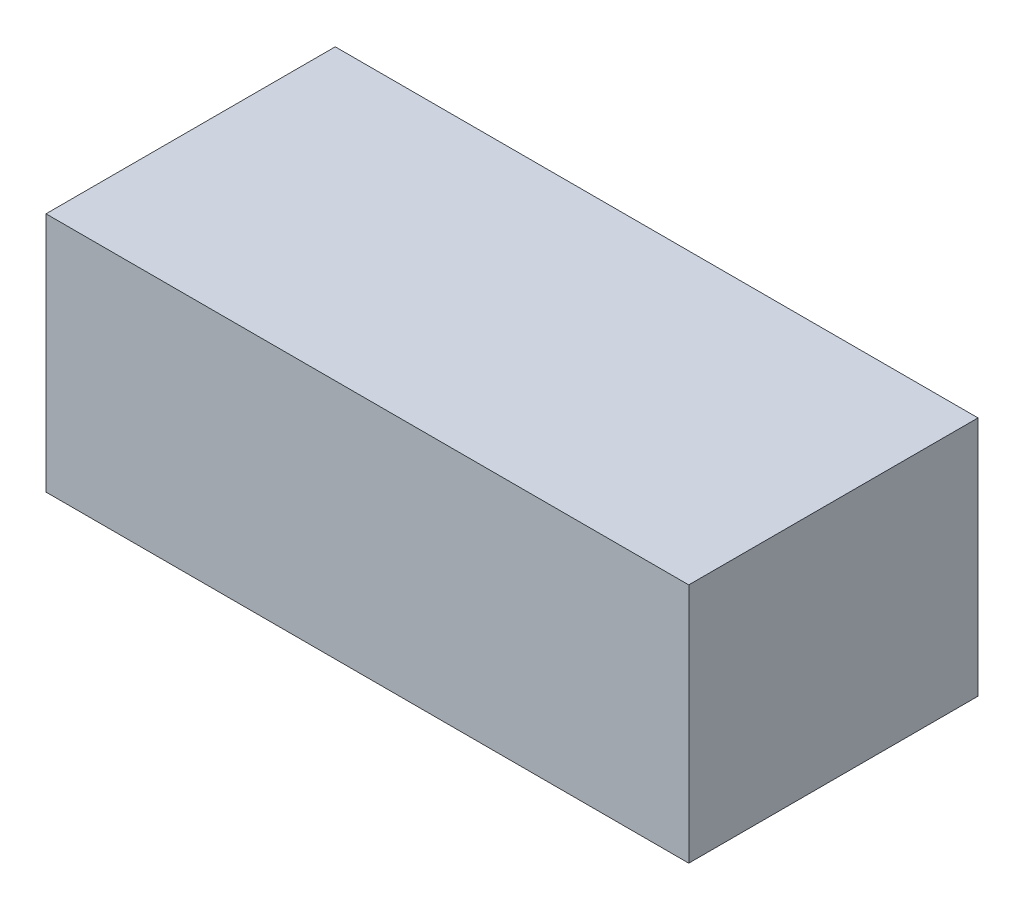
ISO-10303-21;
HEADER;
FILE_DESCRIPTION(('STEP AP214'),'2;1');
FILE_NAME('part.step','',(''),(''),'','','');
FILE_SCHEMA(('AUTOMOTIVE_DESIGN { 1 0 10303 214 1 1 1 1 }'));
ENDSEC;
DATA;
#1=APPLICATION_CONTEXT('core data for automotive mechanical design processes');
#2=APPLICATION_PROTOCOL_DEFINITION('international standard','automotive_design',2000,#1);
#3=PRODUCT_CONTEXT('',#1,'mechanical');
#4=PRODUCT('Part','Part','',(#3));
#5=PRODUCT_RELATED_PRODUCT_CATEGORY('part','',(#4));
#6=PRODUCT_DEFINITION_FORMATION('','',#4);
#7=PRODUCT_DEFINITION_CONTEXT('part definition',#1,'design');
#8=PRODUCT_DEFINITION('design','',#6,#7);
#9=PRODUCT_DEFINITION_SHAPE('','',#8);
#10=(LENGTH_UNIT() NAMED_UNIT(*) SI_UNIT(.MILLI.,.METRE.));
#11=(NAMED_UNIT(*) PLANE_ANGLE_UNIT() SI_UNIT($,.RADIAN.));
#12=(NAMED_UNIT(*) SI_UNIT($,.STERADIAN.) SOLID_ANGLE_UNIT());
#13=UNCERTAINTY_MEASURE_WITH_UNIT(LENGTH_MEASURE(1.E-05),#10,'distance_accuracy_value','');
#14=(GEOMETRIC_REPRESENTATION_CONTEXT(3) GLOBAL_UNCERTAINTY_ASSIGNED_CONTEXT((#13)) GLOBAL_UNIT_ASSIGNED_CONTEXT((#10,
#11,#12)) REPRESENTATION_CONTEXT('',''));
#15=CARTESIAN_POINT('',(0.,0.,0.));
#16=DIRECTION('',(0.,0.,1.));
#17=DIRECTION('',(1.,0.,0.));
#18=AXIS2_PLACEMENT_3D('',#15,#16,#17);
#19=CARTESIAN_POINT('',(0.,75.,0.));
#20=DIRECTION('',(1.,0.,0.));
#21=DIRECTION('',(0.,0.,-1.));
#22=AXIS2_PLACEMENT_3D('',#19,#20,#21);
#23=PLANE('',#22);
#24=DIRECTION('',(0.,0.,1.));
#25=VECTOR('',#24,1.);
#26=CARTESIAN_POINT('',(0.,0.,0.));
#27=LINE('',#26,#25);
#28=CARTESIAN_POINT('',(0.,0.,-90.));
#29=VERTEX_POINT('',#28);
#30=CARTESIAN_POINT('',(0.,0.,0.));
#31=VERTEX_POINT('',#30);
#32=EDGE_CURVE('E119',#29,#31,#27,.T.);
#33=ORIENTED_EDGE('',*,*,#32,.T.);
#34=DIRECTION('',(0.,-1.,0.));
#35=VECTOR('',#34,1.);
#36=CARTESIAN_POINT('',(0.,75.,0.));
#37=LINE('',#36,#35);
#38=CARTESIAN_POINT('',(0.,75.,0.));
#39=VERTEX_POINT('',#38);
#40=EDGE_CURVE('E11',#39,#31,#37,.T.);
#41=ORIENTED_EDGE('',*,*,#40,.F.);
#42=DIRECTION('',(0.,0.,1.));
#43=VECTOR('',#42,1.);
#44=CARTESIAN_POINT('',(0.,75.,0.));
#45=LINE('',#44,#43);
#46=CARTESIAN_POINT('',(0.,75.,-90.));
#47=VERTEX_POINT('',#46);
#48=EDGE_CURVE('E103',#47,#39,#45,.T.);
#49=ORIENTED_EDGE('',*,*,#48,.F.);
#50=DIRECTION('',(0.,-1.,0.));
#51=VECTOR('',#50,1.);
#52=CARTESIAN_POINT('',(0.,75.,-90.));
#53=LINE('',#52,#51);
#54=EDGE_CURVE('E115',#47,#29,#53,.T.);
#55=ORIENTED_EDGE('',*,*,#54,.T.);
#56=EDGE_LOOP('',(#33,#41,#49,#55));
#57=FACE_BOUND('',#56,.T.);
#58=ADVANCED_FACE('F51',(#57),#23,.F.);
#59=CARTESIAN_POINT('',(0.,75.,0.));
#60=DIRECTION('',(0.,0.,-1.));
#61=DIRECTION('',(-1.,0.,0.));
#62=AXIS2_PLACEMENT_3D('',#59,#60,#61);
#63=PLANE('',#62);
#64=DIRECTION('',(1.,0.,0.));
#65=VECTOR('',#64,1.);
#66=CARTESIAN_POINT('',(0.,0.,0.));
#67=LINE('',#66,#65);
#68=CARTESIAN_POINT('',(200.,0.,0.));
#69=VERTEX_POINT('',#68);
#70=EDGE_CURVE('E108',#31,#69,#67,.T.);
#71=ORIENTED_EDGE('',*,*,#70,.T.);
#72=DIRECTION('',(0.,-1.,0.));
#73=VECTOR('',#72,1.);
#74=CARTESIAN_POINT('',(200.,75.,0.));
#75=LINE('',#74,#73);
#76=CARTESIAN_POINT('',(200.,75.,0.));
#77=VERTEX_POINT('',#76);
#78=EDGE_CURVE('E60',#77,#69,#75,.T.);
#79=ORIENTED_EDGE('',*,*,#78,.F.);
#80=DIRECTION('',(1.,0.,0.));
#81=VECTOR('',#80,1.);
#82=CARTESIAN_POINT('',(0.,75.,0.));
#83=LINE('',#82,#81);
#84=EDGE_CURVE('E98',#39,#77,#83,.T.);
#85=ORIENTED_EDGE('',*,*,#84,.F.);
#86=ORIENTED_EDGE('',*,*,#40,.T.);
#87=EDGE_LOOP('',(#71,#79,#85,#86));
#88=FACE_BOUND('',#87,.T.);
#89=ADVANCED_FACE('F107',(#88),#63,.F.);
#90=CARTESIAN_POINT('',(200.,75.,0.));
#91=DIRECTION('',(-1.,0.,0.));
#92=DIRECTION('',(0.,0.,1.));
#93=AXIS2_PLACEMENT_3D('',#90,#91,#92);
#94=PLANE('',#93);
#95=DIRECTION('',(0.,0.,-1.));
#96=VECTOR('',#95,1.);
#97=CARTESIAN_POINT('',(200.,0.,0.));
#98=LINE('',#97,#96);
#99=CARTESIAN_POINT('',(200.,0.,-90.));
#100=VERTEX_POINT('',#99);
#101=EDGE_CURVE('E85',#69,#100,#98,.T.);
#102=ORIENTED_EDGE('',*,*,#101,.T.);
#103=DIRECTION('',(0.,-1.,0.));
#104=VECTOR('',#103,1.);
#105=CARTESIAN_POINT('',(200.,75.,-90.));
#106=LINE('',#105,#104);
#107=CARTESIAN_POINT('',(200.,75.,-90.));
#108=VERTEX_POINT('',#107);
#109=EDGE_CURVE('E110',#108,#100,#106,.T.);
#110=ORIENTED_EDGE('',*,*,#109,.F.);
#111=DIRECTION('',(0.,0.,-1.));
#112=VECTOR('',#111,1.);
#113=CARTESIAN_POINT('',(200.,75.,0.));
#114=LINE('',#113,#112);
#115=EDGE_CURVE('E101',#77,#108,#114,.T.);
#116=ORIENTED_EDGE('',*,*,#115,.F.);
#117=ORIENTED_EDGE('',*,*,#78,.T.);
#118=EDGE_LOOP('',(#102,#110,#116,#117));
#119=FACE_BOUND('',#118,.T.);
#120=ADVANCED_FACE('F111',(#119),#94,.F.);
#121=CARTESIAN_POINT('',(0.,75.,-90.));
#122=DIRECTION('',(0.,0.,1.));
#123=DIRECTION('',(1.,0.,0.));
#124=AXIS2_PLACEMENT_3D('',#121,#122,#123);
#125=PLANE('',#124);
#126=DIRECTION('',(-1.,0.,0.));
#127=VECTOR('',#126,1.);
#128=CARTESIAN_POINT('',(0.,0.,-90.));
#129=LINE('',#128,#127);
#130=EDGE_CURVE('E91',#100,#29,#129,.T.);
#131=ORIENTED_EDGE('',*,*,#130,.T.);
#132=ORIENTED_EDGE('',*,*,#54,.F.);
#133=DIRECTION('',(-1.,0.,0.));
#134=VECTOR('',#133,1.);
#135=CARTESIAN_POINT('',(0.,75.,-90.));
#136=LINE('',#135,#134);
#137=EDGE_CURVE('E68',#108,#47,#136,.T.);
#138=ORIENTED_EDGE('',*,*,#137,.F.);
#139=ORIENTED_EDGE('',*,*,#109,.T.);
#140=EDGE_LOOP('',(#131,#132,#138,#139));
#141=FACE_BOUND('',#140,.T.);
#142=ADVANCED_FACE('F132',(#141),#125,.F.);
#143=CARTESIAN_POINT('',(0.,75.,0.));
#144=DIRECTION('',(0.,-1.,0.));
#145=DIRECTION('',(0.,0.,-1.));
#146=AXIS2_PLACEMENT_3D('',#143,#144,#145);
#147=PLANE('',#146);
#148=ORIENTED_EDGE('',*,*,#48,.T.);
#149=ORIENTED_EDGE('',*,*,#84,.T.);
#150=ORIENTED_EDGE('',*,*,#115,.T.);
#151=ORIENTED_EDGE('',*,*,#137,.T.);
#152=EDGE_LOOP('',(#148,#149,#150,#151));
#153=FACE_BOUND('',#152,.T.);
#154=ADVANCED_FACE('F99',(#153),#147,.F.);
#155=CARTESIAN_POINT('',(0.,0.,0.));
#156=DIRECTION('',(0.,-1.,0.));
#157=DIRECTION('',(0.,0.,-1.));
#158=AXIS2_PLACEMENT_3D('',#155,#156,#157);
#159=PLANE('',#158);
#160=ORIENTED_EDGE('',*,*,#32,.F.);
#161=ORIENTED_EDGE('',*,*,#130,.F.);
#162=ORIENTED_EDGE('',*,*,#101,.F.);
#163=ORIENTED_EDGE('',*,*,#70,.F.);
#164=EDGE_LOOP('',(#160,#161,#162,#163));
#165=FACE_BOUND('',#164,.T.);
#166=ADVANCED_FACE('F135',(#165),#159,.T.);
#167=CLOSED_SHELL('',(#58,#89,#120,#142,#154,#166));
#168=MANIFOLD_SOLID_BREP('B2',#167);
#169=ADVANCED_BREP_SHAPE_REPRESENTATION('',(#18,#168),#14);
#170=SHAPE_DEFINITION_REPRESENTATION(#9,#169);
ENDSEC;
END-ISO-10303-21;
